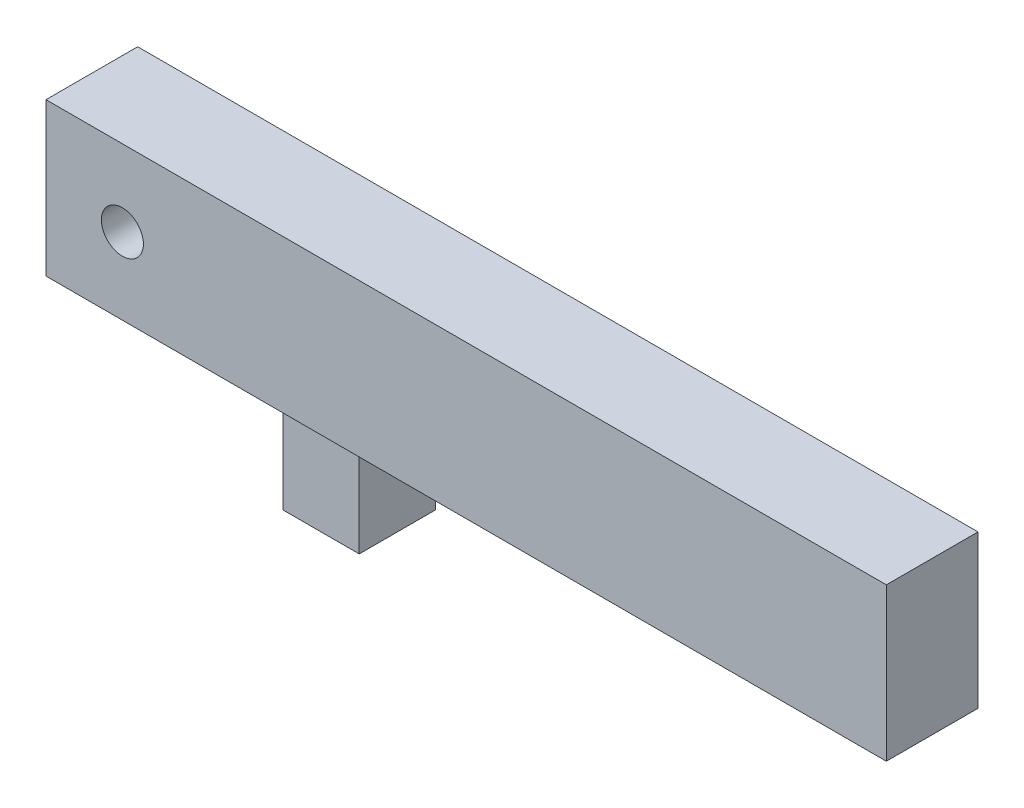
ISO-10303-21;
HEADER;
FILE_DESCRIPTION(('STEP AP214'),'2;1');
FILE_NAME('part.step','',(''),(''),'','','');
FILE_SCHEMA(('AUTOMOTIVE_DESIGN { 1 0 10303 214 1 1 1 1 }'));
ENDSEC;
DATA;
#1=APPLICATION_CONTEXT('core data for automotive mechanical design processes');
#2=APPLICATION_PROTOCOL_DEFINITION('international standard','automotive_design',2000,#1);
#3=PRODUCT_CONTEXT('',#1,'mechanical');
#4=PRODUCT('Part','Part','',(#3));
#5=PRODUCT_RELATED_PRODUCT_CATEGORY('part','',(#4));
#6=PRODUCT_DEFINITION_FORMATION('','',#4);
#7=PRODUCT_DEFINITION_CONTEXT('part definition',#1,'design');
#8=PRODUCT_DEFINITION('design','',#6,#7);
#9=PRODUCT_DEFINITION_SHAPE('','',#8);
#10=(LENGTH_UNIT() NAMED_UNIT(*) SI_UNIT(.MILLI.,.METRE.));
#11=(NAMED_UNIT(*) PLANE_ANGLE_UNIT() SI_UNIT($,.RADIAN.));
#12=(NAMED_UNIT(*) SI_UNIT($,.STERADIAN.) SOLID_ANGLE_UNIT());
#13=UNCERTAINTY_MEASURE_WITH_UNIT(LENGTH_MEASURE(1.E-05),#10,'distance_accuracy_value','');
#14=(GEOMETRIC_REPRESENTATION_CONTEXT(3) GLOBAL_UNCERTAINTY_ASSIGNED_CONTEXT((#13)) GLOBAL_UNIT_ASSIGNED_CONTEXT((#10,
#11,#12)) REPRESENTATION_CONTEXT('',''));
#15=CARTESIAN_POINT('',(0.,0.,0.));
#16=DIRECTION('',(0.,0.,1.));
#17=DIRECTION('',(1.,0.,0.));
#18=AXIS2_PLACEMENT_3D('',#15,#16,#17);
#19=CARTESIAN_POINT('',(0.,0.,12.));
#20=DIRECTION('',(0.,1.,0.));
#21=DIRECTION('',(0.,0.,1.));
#22=AXIS2_PLACEMENT_3D('',#19,#20,#21);
#23=PLANE('',#22);
#24=DIRECTION('',(1.,0.,0.));
#25=VECTOR('',#24,1.);
#26=CARTESIAN_POINT('',(0.,0.,0.));
#27=LINE('',#26,#25);
#28=CARTESIAN_POINT('',(0.,0.,0.));
#29=VERTEX_POINT('',#28);
#30=CARTESIAN_POINT('',(110.,0.,0.));
#31=VERTEX_POINT('',#30);
#32=EDGE_CURVE('E191',#29,#31,#27,.T.);
#33=ORIENTED_EDGE('',*,*,#32,.T.);
#34=DIRECTION('',(0.,0.,-1.));
#35=VECTOR('',#34,1.);
#36=CARTESIAN_POINT('',(110.,0.,12.));
#37=LINE('',#36,#35);
#38=CARTESIAN_POINT('',(110.,0.,12.));
#39=VERTEX_POINT('',#38);
#40=EDGE_CURVE('E60',#39,#31,#37,.T.);
#41=ORIENTED_EDGE('',*,*,#40,.F.);
#42=DIRECTION('',(1.,0.,0.));
#43=VECTOR('',#42,1.);
#44=CARTESIAN_POINT('',(0.,0.,12.));
#45=LINE('',#44,#43);
#46=CARTESIAN_POINT('',(0.,0.,12.));
#47=VERTEX_POINT('',#46);
#48=EDGE_CURVE('E234',#47,#39,#45,.T.);
#49=ORIENTED_EDGE('',*,*,#48,.F.);
#50=DIRECTION('',(0.,0.,-1.));
#51=VECTOR('',#50,1.);
#52=CARTESIAN_POINT('',(0.,0.,12.));
#53=LINE('',#52,#51);
#54=EDGE_CURVE('E11',#47,#29,#53,.T.);
#55=ORIENTED_EDGE('',*,*,#54,.T.);
#56=EDGE_LOOP('',(#33,#41,#49,#55));
#57=FACE_BOUND('',#56,.T.);
#58=DIRECTION('',(0.,0.,-1.));
#59=VECTOR('',#58,1.);
#60=CARTESIAN_POINT('',(30.,0.,11.));
#61=LINE('',#60,#59);
#62=CARTESIAN_POINT('',(30.,0.,11.));
#63=VERTEX_POINT('',#62);
#64=CARTESIAN_POINT('',(30.,0.,0.999999999999999));
#65=VERTEX_POINT('',#64);
#66=EDGE_CURVE('E63',#63,#65,#61,.T.);
#67=ORIENTED_EDGE('',*,*,#66,.F.);
#68=DIRECTION('',(-1.,0.,0.));
#69=VECTOR('',#68,1.);
#70=CARTESIAN_POINT('',(30.,0.,11.));
#71=LINE('',#70,#69);
#72=CARTESIAN_POINT('',(40.,0.,11.));
#73=VERTEX_POINT('',#72);
#74=EDGE_CURVE('E66',#73,#63,#71,.T.);
#75=ORIENTED_EDGE('',*,*,#74,.F.);
#76=DIRECTION('',(0.,0.,1.));
#77=VECTOR('',#76,1.);
#78=CARTESIAN_POINT('',(40.,0.,11.));
#79=LINE('',#78,#77);
#80=CARTESIAN_POINT('',(40.,0.,0.999999999999999));
#81=VERTEX_POINT('',#80);
#82=EDGE_CURVE('E321',#81,#73,#79,.T.);
#83=ORIENTED_EDGE('',*,*,#82,.F.);
#84=DIRECTION('',(1.,0.,0.));
#85=VECTOR('',#84,1.);
#86=CARTESIAN_POINT('',(30.,0.,0.999999999999999));
#87=LINE('',#86,#85);
#88=EDGE_CURVE('E332',#65,#81,#87,.T.);
#89=ORIENTED_EDGE('',*,*,#88,.F.);
#90=EDGE_LOOP('',(#67,#75,#83,#89));
#91=FACE_BOUND('',#90,.T.);
#92=ADVANCED_FACE('F44',(#57,#91),#23,.F.);
#93=CARTESIAN_POINT('',(0.,0.,12.));
#94=DIRECTION('',(0.,0.,-1.));
#95=DIRECTION('',(-1.,0.,0.));
#96=AXIS2_PLACEMENT_3D('',#93,#94,#95);
#97=PLANE('',#96);
#98=DIRECTION('',(0.,-1.,0.));
#99=VECTOR('',#98,1.);
#100=CARTESIAN_POINT('',(0.,0.,12.));
#101=LINE('',#100,#99);
#102=CARTESIAN_POINT('',(0.,20.,12.));
#103=VERTEX_POINT('',#102);
#104=EDGE_CURVE('E157',#103,#47,#101,.T.);
#105=ORIENTED_EDGE('',*,*,#104,.T.);
#106=ORIENTED_EDGE('',*,*,#48,.T.);
#107=DIRECTION('',(0.,1.,0.));
#108=VECTOR('',#107,1.);
#109=CARTESIAN_POINT('',(110.,0.,12.));
#110=LINE('',#109,#108);
#111=CARTESIAN_POINT('',(110.,20.,12.));
#112=VERTEX_POINT('',#111);
#113=EDGE_CURVE('E210',#39,#112,#110,.T.);
#114=ORIENTED_EDGE('',*,*,#113,.T.);
#115=DIRECTION('',(-1.,0.,0.));
#116=VECTOR('',#115,1.);
#117=CARTESIAN_POINT('',(0.,20.,12.));
#118=LINE('',#117,#116);
#119=EDGE_CURVE('E224',#112,#103,#118,.T.);
#120=ORIENTED_EDGE('',*,*,#119,.T.);
#121=EDGE_LOOP('',(#105,#106,#114,#120));
#122=FACE_BOUND('',#121,.T.);
#123=CARTESIAN_POINT('',(10.,10.,12.000012));
#124=DIRECTION('',(0.,0.,1.));
#125=DIRECTION('',(1.,0.,0.));
#126=AXIS2_PLACEMENT_3D('',#123,#124,#125);
#127=CIRCLE('',#126,2.75);
#128=CARTESIAN_POINT('',(12.75,10.,12.000012));
#129=VERTEX_POINT('',#128);
#130=EDGE_CURVE('E139',#129,#129,#127,.T.);
#131=ORIENTED_EDGE('',*,*,#130,.F.);
#132=EDGE_LOOP('',(#131));
#133=FACE_BOUND('',#132,.T.);
#134=ADVANCED_FACE('F174',(#122,#133),#97,.F.);
#135=CARTESIAN_POINT('',(0.,0.,12.));
#136=DIRECTION('',(1.,0.,0.));
#137=DIRECTION('',(0.,1.,0.));
#138=AXIS2_PLACEMENT_3D('',#135,#136,#137);
#139=PLANE('',#138);
#140=DIRECTION('',(0.,-1.,0.));
#141=VECTOR('',#140,1.);
#142=CARTESIAN_POINT('',(0.,0.,0.));
#143=LINE('',#142,#141);
#144=CARTESIAN_POINT('',(0.,20.,0.));
#145=VERTEX_POINT('',#144);
#146=EDGE_CURVE('E151',#145,#29,#143,.T.);
#147=ORIENTED_EDGE('',*,*,#146,.T.);
#148=ORIENTED_EDGE('',*,*,#54,.F.);
#149=ORIENTED_EDGE('',*,*,#104,.F.);
#150=DIRECTION('',(0.,0.,-1.));
#151=VECTOR('',#150,1.);
#152=CARTESIAN_POINT('',(0.,20.,12.));
#153=LINE('',#152,#151);
#154=EDGE_CURVE('E218',#103,#145,#153,.T.);
#155=ORIENTED_EDGE('',*,*,#154,.T.);
#156=EDGE_LOOP('',(#147,#148,#149,#155));
#157=FACE_BOUND('',#156,.T.);
#158=ADVANCED_FACE('F50',(#157),#139,.F.);
#159=CARTESIAN_POINT('',(110.,0.,12.));
#160=DIRECTION('',(-1.,0.,0.));
#161=DIRECTION('',(0.,-1.,0.));
#162=AXIS2_PLACEMENT_3D('',#159,#160,#161);
#163=PLANE('',#162);
#164=DIRECTION('',(0.,1.,0.));
#165=VECTOR('',#164,1.);
#166=CARTESIAN_POINT('',(110.,0.,0.));
#167=LINE('',#166,#165);
#168=CARTESIAN_POINT('',(110.,20.,0.));
#169=VERTEX_POINT('',#168);
#170=EDGE_CURVE('E201',#31,#169,#167,.T.);
#171=ORIENTED_EDGE('',*,*,#170,.T.);
#172=DIRECTION('',(0.,0.,-1.));
#173=VECTOR('',#172,1.);
#174=CARTESIAN_POINT('',(110.,20.,12.));
#175=LINE('',#174,#173);
#176=EDGE_CURVE('E207',#112,#169,#175,.T.);
#177=ORIENTED_EDGE('',*,*,#176,.F.);
#178=ORIENTED_EDGE('',*,*,#113,.F.);
#179=ORIENTED_EDGE('',*,*,#40,.T.);
#180=EDGE_LOOP('',(#171,#177,#178,#179));
#181=FACE_BOUND('',#180,.T.);
#182=ADVANCED_FACE('F184',(#181),#163,.F.);
#183=CARTESIAN_POINT('',(0.,20.,12.));
#184=DIRECTION('',(0.,-1.,0.));
#185=DIRECTION('',(0.,0.,-1.));
#186=AXIS2_PLACEMENT_3D('',#183,#184,#185);
#187=PLANE('',#186);
#188=DIRECTION('',(-1.,0.,0.));
#189=VECTOR('',#188,1.);
#190=CARTESIAN_POINT('',(0.,20.,0.));
#191=LINE('',#190,#189);
#192=EDGE_CURVE('E215',#169,#145,#191,.T.);
#193=ORIENTED_EDGE('',*,*,#192,.T.);
#194=ORIENTED_EDGE('',*,*,#154,.F.);
#195=ORIENTED_EDGE('',*,*,#119,.F.);
#196=ORIENTED_EDGE('',*,*,#176,.T.);
#197=EDGE_LOOP('',(#193,#194,#195,#196));
#198=FACE_BOUND('',#197,.T.);
#199=ADVANCED_FACE('F178',(#198),#187,.F.);
#200=CARTESIAN_POINT('',(0.,0.,0.));
#201=DIRECTION('',(0.,0.,-1.));
#202=DIRECTION('',(-1.,0.,0.));
#203=AXIS2_PLACEMENT_3D('',#200,#201,#202);
#204=PLANE('',#203);
#205=CARTESIAN_POINT('',(10.,10.,0.));
#206=DIRECTION('',(0.,0.,1.));
#207=DIRECTION('',(1.,0.,0.));
#208=AXIS2_PLACEMENT_3D('',#205,#206,#207);
#209=CIRCLE('',#208,2.75);
#210=CARTESIAN_POINT('',(12.75,10.,0.));
#211=VERTEX_POINT('',#210);
#212=EDGE_CURVE('E141',#211,#211,#209,.T.);
#213=ORIENTED_EDGE('',*,*,#212,.T.);
#214=EDGE_LOOP('',(#213));
#215=FACE_BOUND('',#214,.T.);
#216=ORIENTED_EDGE('',*,*,#146,.F.);
#217=ORIENTED_EDGE('',*,*,#192,.F.);
#218=ORIENTED_EDGE('',*,*,#170,.F.);
#219=ORIENTED_EDGE('',*,*,#32,.F.);
#220=EDGE_LOOP('',(#216,#217,#218,#219));
#221=FACE_BOUND('',#220,.T.);
#222=ADVANCED_FACE('F168',(#215,#221),#204,.T.);
#223=CARTESIAN_POINT('',(10.,10.,0.));
#224=DIRECTION('',(0.,0.,1.));
#225=DIRECTION('',(1.,0.,0.));
#226=AXIS2_PLACEMENT_3D('',#223,#224,#225);
#227=CYLINDRICAL_SURFACE('',#226,2.75);
#228=ORIENTED_EDGE('',*,*,#212,.F.);
#229=EDGE_LOOP('',(#228));
#230=FACE_BOUND('',#229,.T.);
#231=ORIENTED_EDGE('',*,*,#130,.T.);
#232=EDGE_LOOP('',(#231));
#233=FACE_BOUND('',#232,.T.);
#234=ADVANCED_FACE('F161',(#230,#233),#227,.F.);
#235=CARTESIAN_POINT('',(30.,-12.,11.));
#236=DIRECTION('',(1.,0.,0.));
#237=DIRECTION('',(0.,0.,-1.));
#238=AXIS2_PLACEMENT_3D('',#235,#236,#237);
#239=PLANE('',#238);
#240=ORIENTED_EDGE('',*,*,#66,.T.);
#241=DIRECTION('',(0.,1.,0.));
#242=VECTOR('',#241,1.);
#243=CARTESIAN_POINT('',(30.,-12.,0.999999999999999));
#244=LINE('',#243,#242);
#245=CARTESIAN_POINT('',(30.,-12.,0.999999999999999));
#246=VERTEX_POINT('',#245);
#247=EDGE_CURVE('E119',#246,#65,#244,.T.);
#248=ORIENTED_EDGE('',*,*,#247,.F.);
#249=DIRECTION('',(0.,0.,-1.));
#250=VECTOR('',#249,1.);
#251=CARTESIAN_POINT('',(30.,-12.,11.));
#252=LINE('',#251,#250);
#253=CARTESIAN_POINT('',(30.,-12.,11.));
#254=VERTEX_POINT('',#253);
#255=EDGE_CURVE('E123',#254,#246,#252,.T.);
#256=ORIENTED_EDGE('',*,*,#255,.F.);
#257=DIRECTION('',(0.,1.,0.));
#258=VECTOR('',#257,1.);
#259=CARTESIAN_POINT('',(30.,-12.,11.));
#260=LINE('',#259,#258);
#261=EDGE_CURVE('E318',#254,#63,#260,.T.);
#262=ORIENTED_EDGE('',*,*,#261,.T.);
#263=EDGE_LOOP('',(#240,#248,#256,#262));
#264=FACE_BOUND('',#263,.T.);
#265=ADVANCED_FACE('F137',(#264),#239,.F.);
#266=CARTESIAN_POINT('',(30.,-12.,0.999999999999999));
#267=DIRECTION('',(0.,0.,1.));
#268=DIRECTION('',(1.,0.,0.));
#269=AXIS2_PLACEMENT_3D('',#266,#267,#268);
#270=PLANE('',#269);
#271=ORIENTED_EDGE('',*,*,#88,.T.);
#272=DIRECTION('',(0.,1.,0.));
#273=VECTOR('',#272,1.);
#274=CARTESIAN_POINT('',(40.,-12.,0.999999999999999));
#275=LINE('',#274,#273);
#276=CARTESIAN_POINT('',(40.,-12.,0.999999999999999));
#277=VERTEX_POINT('',#276);
#278=EDGE_CURVE('E118',#277,#81,#275,.T.);
#279=ORIENTED_EDGE('',*,*,#278,.F.);
#280=DIRECTION('',(1.,0.,0.));
#281=VECTOR('',#280,1.);
#282=CARTESIAN_POINT('',(30.,-12.,0.999999999999999));
#283=LINE('',#282,#281);
#284=EDGE_CURVE('E114',#246,#277,#283,.T.);
#285=ORIENTED_EDGE('',*,*,#284,.F.);
#286=ORIENTED_EDGE('',*,*,#247,.T.);
#287=EDGE_LOOP('',(#271,#279,#285,#286));
#288=FACE_BOUND('',#287,.T.);
#289=ADVANCED_FACE('F117',(#288),#270,.F.);
#290=CARTESIAN_POINT('',(40.,-12.,11.));
#291=DIRECTION('',(-1.,0.,0.));
#292=DIRECTION('',(0.,0.,1.));
#293=AXIS2_PLACEMENT_3D('',#290,#291,#292);
#294=PLANE('',#293);
#295=ORIENTED_EDGE('',*,*,#82,.T.);
#296=DIRECTION('',(0.,1.,0.));
#297=VECTOR('',#296,1.);
#298=CARTESIAN_POINT('',(40.,-12.,11.));
#299=LINE('',#298,#297);
#300=CARTESIAN_POINT('',(40.,-12.,11.));
#301=VERTEX_POINT('',#300);
#302=EDGE_CURVE('E145',#301,#73,#299,.T.);
#303=ORIENTED_EDGE('',*,*,#302,.F.);
#304=DIRECTION('',(0.,0.,1.));
#305=VECTOR('',#304,1.);
#306=CARTESIAN_POINT('',(40.,-12.,11.));
#307=LINE('',#306,#305);
#308=EDGE_CURVE('E121',#277,#301,#307,.T.);
#309=ORIENTED_EDGE('',*,*,#308,.F.);
#310=ORIENTED_EDGE('',*,*,#278,.T.);
#311=EDGE_LOOP('',(#295,#303,#309,#310));
#312=FACE_BOUND('',#311,.T.);
#313=ADVANCED_FACE('F289',(#312),#294,.F.);
#314=CARTESIAN_POINT('',(30.,-12.,11.));
#315=DIRECTION('',(0.,0.,-1.));
#316=DIRECTION('',(-1.,0.,0.));
#317=AXIS2_PLACEMENT_3D('',#314,#315,#316);
#318=PLANE('',#317);
#319=ORIENTED_EDGE('',*,*,#74,.T.);
#320=ORIENTED_EDGE('',*,*,#261,.F.);
#321=DIRECTION('',(-1.,0.,0.));
#322=VECTOR('',#321,1.);
#323=CARTESIAN_POINT('',(30.,-12.,11.));
#324=LINE('',#323,#322);
#325=EDGE_CURVE('E128',#301,#254,#324,.T.);
#326=ORIENTED_EDGE('',*,*,#325,.F.);
#327=ORIENTED_EDGE('',*,*,#302,.T.);
#328=EDGE_LOOP('',(#319,#320,#326,#327));
#329=FACE_BOUND('',#328,.T.);
#330=ADVANCED_FACE('F297',(#329),#318,.F.);
#331=CARTESIAN_POINT('',(0.,-12.,0.));
#332=DIRECTION('',(0.,-1.,0.));
#333=DIRECTION('',(0.,0.,-1.));
#334=AXIS2_PLACEMENT_3D('',#331,#332,#333);
#335=PLANE('',#334);
#336=ORIENTED_EDGE('',*,*,#255,.T.);
#337=ORIENTED_EDGE('',*,*,#284,.T.);
#338=ORIENTED_EDGE('',*,*,#308,.T.);
#339=ORIENTED_EDGE('',*,*,#325,.T.);
#340=EDGE_LOOP('',(#336,#337,#338,#339));
#341=FACE_BOUND('',#340,.T.);
#342=ADVANCED_FACE('F126',(#341),#335,.T.);
#343=CLOSED_SHELL('',(#92,#134,#158,#182,#199,#222,#234,#265,#289,#313,#330,#342));
#344=MANIFOLD_SOLID_BREP('B2',#343);
#345=ADVANCED_BREP_SHAPE_REPRESENTATION('',(#18,#344),#14);
#346=SHAPE_DEFINITION_REPRESENTATION(#9,#345);
ENDSEC;
END-ISO-10303-21;
